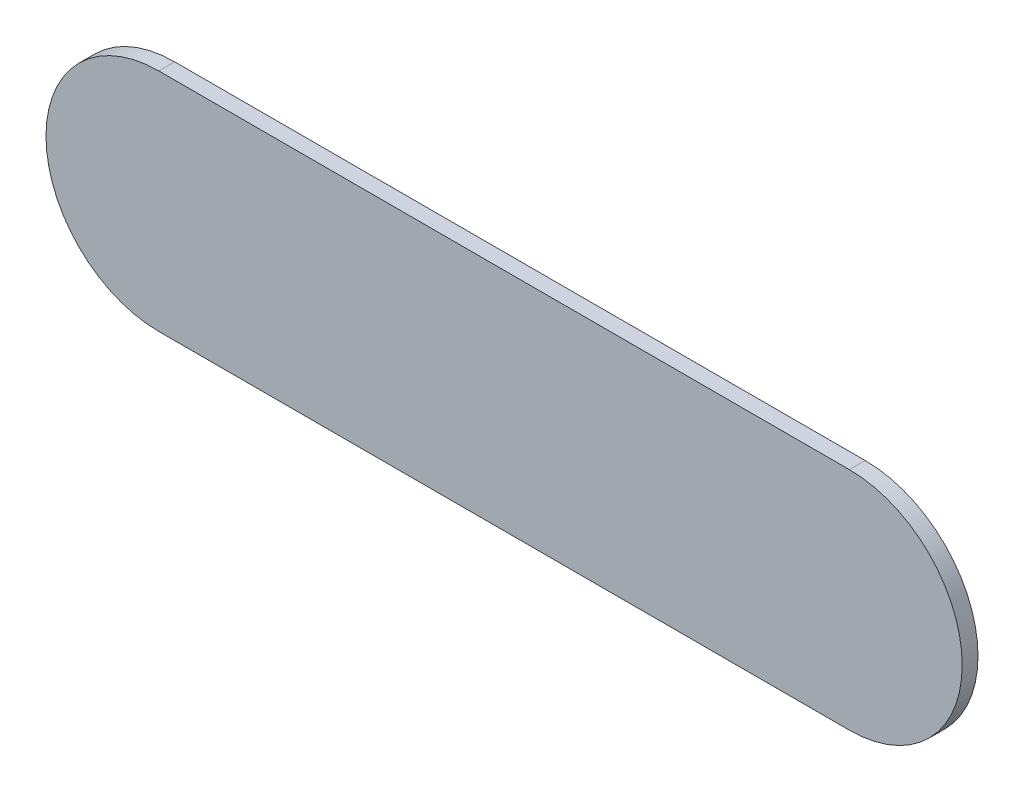
ISO-10303-21;
HEADER;
FILE_DESCRIPTION(('STEP AP214'),'2;1');
FILE_NAME('part.step','',(''),(''),'','','');
FILE_SCHEMA(('AUTOMOTIVE_DESIGN { 1 0 10303 214 1 1 1 1 }'));
ENDSEC;
DATA;
#1=APPLICATION_CONTEXT('core data for automotive mechanical design processes');
#2=APPLICATION_PROTOCOL_DEFINITION('international standard','automotive_design',2000,#1);
#3=PRODUCT_CONTEXT('',#1,'mechanical');
#4=PRODUCT('Part','Part','',(#3));
#5=PRODUCT_RELATED_PRODUCT_CATEGORY('part','',(#4));
#6=PRODUCT_DEFINITION_FORMATION('','',#4);
#7=PRODUCT_DEFINITION_CONTEXT('part definition',#1,'design');
#8=PRODUCT_DEFINITION('design','',#6,#7);
#9=PRODUCT_DEFINITION_SHAPE('','',#8);
#10=(LENGTH_UNIT() NAMED_UNIT(*) SI_UNIT(.MILLI.,.METRE.));
#11=(NAMED_UNIT(*) PLANE_ANGLE_UNIT() SI_UNIT($,.RADIAN.));
#12=(NAMED_UNIT(*) SI_UNIT($,.STERADIAN.) SOLID_ANGLE_UNIT());
#13=UNCERTAINTY_MEASURE_WITH_UNIT(LENGTH_MEASURE(1.E-05),#10,'distance_accuracy_value','');
#14=(GEOMETRIC_REPRESENTATION_CONTEXT(3) GLOBAL_UNCERTAINTY_ASSIGNED_CONTEXT((#13)) GLOBAL_UNIT_ASSIGNED_CONTEXT((#10,
#11,#12)) REPRESENTATION_CONTEXT('',''));
#15=CARTESIAN_POINT('',(0.,0.,0.));
#16=DIRECTION('',(0.,0.,1.));
#17=DIRECTION('',(1.,0.,0.));
#18=AXIS2_PLACEMENT_3D('',#15,#16,#17);
#19=CARTESIAN_POINT('',(103.3,-121.95,1.635));
#20=DIRECTION('',(0.,0.,1.));
#21=DIRECTION('',(1.,0.,0.));
#22=AXIS2_PLACEMENT_3D('',#19,#20,#21);
#23=PLANE('',#22);
#24=DIRECTION('',(-1.,0.,0.));
#25=VECTOR('',#24,1.);
#26=CARTESIAN_POINT('',(103.3,-121.95,1.635));
#27=LINE('',#26,#25);
#28=CARTESIAN_POINT('',(103.3,-121.95,1.635));
#29=VERTEX_POINT('',#28);
#30=CARTESIAN_POINT('',(101.770001,-121.95,1.635));
#31=VERTEX_POINT('',#30);
#32=EDGE_CURVE('E81',#29,#31,#27,.T.);
#33=ORIENTED_EDGE('',*,*,#32,.T.);
#34=CARTESIAN_POINT('',(101.770001,-122.2,1.635));
#35=DIRECTION('',(0.,0.,1.));
#36=DIRECTION('',(0.,1.,0.));
#37=AXIS2_PLACEMENT_3D('',#34,#35,#36);
#38=CIRCLE('',#37,0.25);
#39=CARTESIAN_POINT('',(101.770001,-122.45,1.635));
#40=VERTEX_POINT('',#39);
#41=EDGE_CURVE('E79',#31,#40,#38,.T.);
#42=ORIENTED_EDGE('',*,*,#41,.T.);
#43=DIRECTION('',(1.,0.,0.));
#44=VECTOR('',#43,1.);
#45=CARTESIAN_POINT('',(101.770001,-122.45,1.635));
#46=LINE('',#45,#44);
#47=CARTESIAN_POINT('',(103.3,-122.45,1.635));
#48=VERTEX_POINT('',#47);
#49=EDGE_CURVE('E69',#40,#48,#46,.T.);
#50=ORIENTED_EDGE('',*,*,#49,.T.);
#51=CARTESIAN_POINT('',(103.3,-122.2,1.635));
#52=DIRECTION('',(0.,0.,1.));
#53=DIRECTION('',(0.,-1.,0.));
#54=AXIS2_PLACEMENT_3D('',#51,#52,#53);
#55=CIRCLE('',#54,0.25);
#56=EDGE_CURVE('E11',#48,#29,#55,.T.);
#57=ORIENTED_EDGE('',*,*,#56,.T.);
#58=EDGE_LOOP('',(#33,#42,#50,#57));
#59=FACE_BOUND('',#58,.T.);
#60=ADVANCED_FACE('F17',(#59),#23,.T.);
#61=CARTESIAN_POINT('',(103.3,-121.95,1.6));
#62=DIRECTION('',(0.,0.,1.));
#63=DIRECTION('',(1.,0.,0.));
#64=AXIS2_PLACEMENT_3D('',#61,#62,#63);
#65=PLANE('',#64);
#66=CARTESIAN_POINT('',(103.3,-122.2,1.6));
#67=DIRECTION('',(0.,0.,1.));
#68=DIRECTION('',(0.,-1.,0.));
#69=AXIS2_PLACEMENT_3D('',#66,#67,#68);
#70=CIRCLE('',#69,0.25);
#71=CARTESIAN_POINT('',(103.3,-122.45,1.6));
#72=VERTEX_POINT('',#71);
#73=CARTESIAN_POINT('',(103.3,-121.95,1.6));
#74=VERTEX_POINT('',#73);
#75=EDGE_CURVE('E20',#72,#74,#70,.T.);
#76=ORIENTED_EDGE('',*,*,#75,.F.);
#77=DIRECTION('',(1.,0.,0.));
#78=VECTOR('',#77,1.);
#79=CARTESIAN_POINT('',(101.770001,-122.45,1.6));
#80=LINE('',#79,#78);
#81=CARTESIAN_POINT('',(101.770001,-122.45,1.6));
#82=VERTEX_POINT('',#81);
#83=EDGE_CURVE('E62',#82,#72,#80,.T.);
#84=ORIENTED_EDGE('',*,*,#83,.F.);
#85=CARTESIAN_POINT('',(101.770001,-122.2,1.6));
#86=DIRECTION('',(0.,0.,1.));
#87=DIRECTION('',(0.,1.,0.));
#88=AXIS2_PLACEMENT_3D('',#85,#86,#87);
#89=CIRCLE('',#88,0.25);
#90=CARTESIAN_POINT('',(101.770001,-121.95,1.6));
#91=VERTEX_POINT('',#90);
#92=EDGE_CURVE('E88',#91,#82,#89,.T.);
#93=ORIENTED_EDGE('',*,*,#92,.F.);
#94=DIRECTION('',(-1.,0.,0.));
#95=VECTOR('',#94,1.);
#96=CARTESIAN_POINT('',(103.3,-121.95,1.6));
#97=LINE('',#96,#95);
#98=EDGE_CURVE('E98',#74,#91,#97,.T.);
#99=ORIENTED_EDGE('',*,*,#98,.F.);
#100=EDGE_LOOP('',(#76,#84,#93,#99));
#101=FACE_BOUND('',#100,.T.);
#102=ADVANCED_FACE('F180',(#101),#65,.F.);
#103=CARTESIAN_POINT('',(103.3,-122.2,1.6));
#104=DIRECTION('',(0.,0.,-1.));
#105=DIRECTION('',(0.,-1.,0.));
#106=AXIS2_PLACEMENT_3D('',#103,#104,#105);
#107=CYLINDRICAL_SURFACE('',#106,0.25);
#108=ORIENTED_EDGE('',*,*,#75,.T.);
#109=DIRECTION('',(0.,0.,1.));
#110=VECTOR('',#109,1.);
#111=CARTESIAN_POINT('',(103.3,-121.95,1.6));
#112=LINE('',#111,#110);
#113=EDGE_CURVE('E95',#74,#29,#112,.T.);
#114=ORIENTED_EDGE('',*,*,#113,.T.);
#115=ORIENTED_EDGE('',*,*,#56,.F.);
#116=DIRECTION('',(0.,0.,1.));
#117=VECTOR('',#116,1.);
#118=CARTESIAN_POINT('',(103.3,-122.45,1.6));
#119=LINE('',#118,#117);
#120=EDGE_CURVE('E75',#72,#48,#119,.T.);
#121=ORIENTED_EDGE('',*,*,#120,.F.);
#122=EDGE_LOOP('',(#108,#114,#115,#121));
#123=FACE_BOUND('',#122,.T.);
#124=ADVANCED_FACE('F172',(#123),#107,.T.);
#125=CARTESIAN_POINT('',(101.770001,-122.45,1.6));
#126=DIRECTION('',(0.,1.,0.));
#127=DIRECTION('',(1.,0.,0.));
#128=AXIS2_PLACEMENT_3D('',#125,#126,#127);
#129=PLANE('',#128);
#130=ORIENTED_EDGE('',*,*,#83,.T.);
#131=ORIENTED_EDGE('',*,*,#120,.T.);
#132=ORIENTED_EDGE('',*,*,#49,.F.);
#133=DIRECTION('',(0.,0.,1.));
#134=VECTOR('',#133,1.);
#135=CARTESIAN_POINT('',(101.770001,-122.45,1.6));
#136=LINE('',#135,#134);
#137=EDGE_CURVE('E73',#82,#40,#136,.T.);
#138=ORIENTED_EDGE('',*,*,#137,.F.);
#139=EDGE_LOOP('',(#130,#131,#132,#138));
#140=FACE_BOUND('',#139,.T.);
#141=ADVANCED_FACE('F71',(#140),#129,.F.);
#142=CARTESIAN_POINT('',(101.770001,-122.2,1.6));
#143=DIRECTION('',(0.,0.,-1.));
#144=DIRECTION('',(0.,1.,0.));
#145=AXIS2_PLACEMENT_3D('',#142,#143,#144);
#146=CYLINDRICAL_SURFACE('',#145,0.25);
#147=ORIENTED_EDGE('',*,*,#92,.T.);
#148=ORIENTED_EDGE('',*,*,#137,.T.);
#149=ORIENTED_EDGE('',*,*,#41,.F.);
#150=DIRECTION('',(0.,0.,1.));
#151=VECTOR('',#150,1.);
#152=CARTESIAN_POINT('',(101.770001,-121.95,1.6));
#153=LINE('',#152,#151);
#154=EDGE_CURVE('E101',#91,#31,#153,.T.);
#155=ORIENTED_EDGE('',*,*,#154,.F.);
#156=EDGE_LOOP('',(#147,#148,#149,#155));
#157=FACE_BOUND('',#156,.T.);
#158=ADVANCED_FACE('F87',(#157),#146,.T.);
#159=CARTESIAN_POINT('',(103.3,-121.95,1.6));
#160=DIRECTION('',(0.,-1.,0.));
#161=DIRECTION('',(0.,0.,-1.));
#162=AXIS2_PLACEMENT_3D('',#159,#160,#161);
#163=PLANE('',#162);
#164=ORIENTED_EDGE('',*,*,#98,.T.);
#165=ORIENTED_EDGE('',*,*,#154,.T.);
#166=ORIENTED_EDGE('',*,*,#32,.F.);
#167=ORIENTED_EDGE('',*,*,#113,.F.);
#168=EDGE_LOOP('',(#164,#165,#166,#167));
#169=FACE_BOUND('',#168,.T.);
#170=ADVANCED_FACE('F146',(#169),#163,.F.);
#171=CLOSED_SHELL('',(#60,#102,#124,#141,#158,#170));
#172=MANIFOLD_SOLID_BREP('B1',#171);
#173=ADVANCED_BREP_SHAPE_REPRESENTATION('',(#18,#172),#14);
#174=SHAPE_DEFINITION_REPRESENTATION(#9,#173);
ENDSEC;
END-ISO-10303-21;
